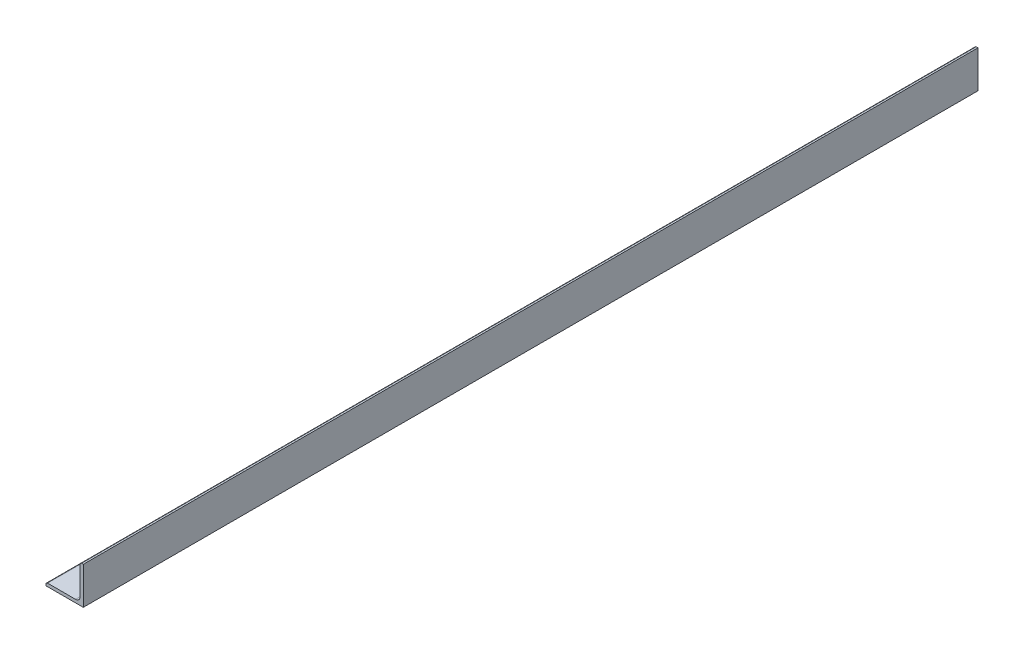
ISO-10303-21;
HEADER;
FILE_DESCRIPTION(('STEP AP214'),'2;1');
FILE_NAME('part.step','',(''),(''),'','','');
FILE_SCHEMA(('AUTOMOTIVE_DESIGN { 1 0 10303 214 1 1 1 1 }'));
ENDSEC;
DATA;
#1=APPLICATION_CONTEXT('core data for automotive mechanical design processes');
#2=APPLICATION_PROTOCOL_DEFINITION('international standard','automotive_design',2000,#1);
#3=PRODUCT_CONTEXT('',#1,'mechanical');
#4=PRODUCT('Part','Part','',(#3));
#5=PRODUCT_RELATED_PRODUCT_CATEGORY('part','',(#4));
#6=PRODUCT_DEFINITION_FORMATION('','',#4);
#7=PRODUCT_DEFINITION_CONTEXT('part definition',#1,'design');
#8=PRODUCT_DEFINITION('design','',#6,#7);
#9=PRODUCT_DEFINITION_SHAPE('','',#8);
#10=(LENGTH_UNIT() NAMED_UNIT(*) SI_UNIT(.MILLI.,.METRE.));
#11=(NAMED_UNIT(*) PLANE_ANGLE_UNIT() SI_UNIT($,.RADIAN.));
#12=(NAMED_UNIT(*) SI_UNIT($,.STERADIAN.) SOLID_ANGLE_UNIT());
#13=UNCERTAINTY_MEASURE_WITH_UNIT(LENGTH_MEASURE(1.E-05),#10,'distance_accuracy_value','');
#14=(GEOMETRIC_REPRESENTATION_CONTEXT(3) GLOBAL_UNCERTAINTY_ASSIGNED_CONTEXT((#13)) GLOBAL_UNIT_ASSIGNED_CONTEXT((#10,
#11,#12)) REPRESENTATION_CONTEXT('',''));
#15=CARTESIAN_POINT('',(0.,0.,0.));
#16=DIRECTION('',(0.,0.,1.));
#17=DIRECTION('',(1.,0.,0.));
#18=AXIS2_PLACEMENT_3D('',#15,#16,#17);
#19=CARTESIAN_POINT('',(-19.05,-17.4625,457.2));
#20=DIRECTION('',(1.,0.,0.));
#21=DIRECTION('',(0.,0.,-1.));
#22=AXIS2_PLACEMENT_3D('',#19,#20,#21);
#23=PLANE('',#22);
#24=DIRECTION('',(0.,-1.,0.));
#25=VECTOR('',#24,1.);
#26=CARTESIAN_POINT('',(-19.05,-17.4625,-457.2));
#27=LINE('',#26,#25);
#28=CARTESIAN_POINT('',(-19.05,-17.4625,-457.2));
#29=VERTEX_POINT('',#28);
#30=CARTESIAN_POINT('',(-19.05,-19.05,-457.2));
#31=VERTEX_POINT('',#30);
#32=EDGE_CURVE('E150',#29,#31,#27,.T.);
#33=ORIENTED_EDGE('',*,*,#32,.T.);
#34=DIRECTION('',(0.,0.,-1.));
#35=VECTOR('',#34,1.);
#36=CARTESIAN_POINT('',(-19.05,-19.05,457.2));
#37=LINE('',#36,#35);
#38=CARTESIAN_POINT('',(-19.05,-19.05,457.2));
#39=VERTEX_POINT('',#38);
#40=EDGE_CURVE('E11',#39,#31,#37,.T.);
#41=ORIENTED_EDGE('',*,*,#40,.F.);
#42=DIRECTION('',(0.,-1.,0.));
#43=VECTOR('',#42,1.);
#44=CARTESIAN_POINT('',(-19.05,-17.4625,457.2));
#45=LINE('',#44,#43);
#46=CARTESIAN_POINT('',(-19.05,-17.4625,457.2));
#47=VERTEX_POINT('',#46);
#48=EDGE_CURVE('E175',#47,#39,#45,.T.);
#49=ORIENTED_EDGE('',*,*,#48,.F.);
#50=DIRECTION('',(0.,0.,-1.));
#51=VECTOR('',#50,1.);
#52=CARTESIAN_POINT('',(-19.05,-17.4625,457.2));
#53=LINE('',#52,#51);
#54=EDGE_CURVE('E146',#47,#29,#53,.T.);
#55=ORIENTED_EDGE('',*,*,#54,.T.);
#56=EDGE_LOOP('',(#33,#41,#49,#55));
#57=FACE_BOUND('',#56,.T.);
#58=ADVANCED_FACE('F43',(#57),#23,.F.);
#59=CARTESIAN_POINT('',(-19.05,-19.05,457.2));
#60=DIRECTION('',(0.,1.,0.));
#61=DIRECTION('',(-1.,0.,0.));
#62=AXIS2_PLACEMENT_3D('',#59,#60,#61);
#63=PLANE('',#62);
#64=DIRECTION('',(1.,0.,0.));
#65=VECTOR('',#64,1.);
#66=CARTESIAN_POINT('',(-19.05,-19.05,-457.2));
#67=LINE('',#66,#65);
#68=CARTESIAN_POINT('',(19.05,-19.05,-457.2));
#69=VERTEX_POINT('',#68);
#70=EDGE_CURVE('E154',#31,#69,#67,.T.);
#71=ORIENTED_EDGE('',*,*,#70,.T.);
#72=DIRECTION('',(0.,0.,-1.));
#73=VECTOR('',#72,1.);
#74=CARTESIAN_POINT('',(19.05,-19.05,457.2));
#75=LINE('',#74,#73);
#76=CARTESIAN_POINT('',(19.05,-19.05,457.2));
#77=VERTEX_POINT('',#76);
#78=EDGE_CURVE('E52',#77,#69,#75,.T.);
#79=ORIENTED_EDGE('',*,*,#78,.F.);
#80=DIRECTION('',(1.,0.,0.));
#81=VECTOR('',#80,1.);
#82=CARTESIAN_POINT('',(-19.05,-19.05,457.2));
#83=LINE('',#82,#81);
#84=EDGE_CURVE('E106',#39,#77,#83,.T.);
#85=ORIENTED_EDGE('',*,*,#84,.F.);
#86=ORIENTED_EDGE('',*,*,#40,.T.);
#87=EDGE_LOOP('',(#71,#79,#85,#86));
#88=FACE_BOUND('',#87,.T.);
#89=ADVANCED_FACE('F231',(#88),#63,.F.);
#90=CARTESIAN_POINT('',(19.05,-19.05,457.2));
#91=DIRECTION('',(-1.,0.,0.));
#92=DIRECTION('',(0.,-1.,0.));
#93=AXIS2_PLACEMENT_3D('',#90,#91,#92);
#94=PLANE('',#93);
#95=DIRECTION('',(0.,1.,0.));
#96=VECTOR('',#95,1.);
#97=CARTESIAN_POINT('',(19.05,-19.05,-457.2));
#98=LINE('',#97,#96);
#99=CARTESIAN_POINT('',(19.05,19.05,-457.2));
#100=VERTEX_POINT('',#99);
#101=EDGE_CURVE('E157',#69,#100,#98,.T.);
#102=ORIENTED_EDGE('',*,*,#101,.T.);
#103=DIRECTION('',(0.,0.,-1.));
#104=VECTOR('',#103,1.);
#105=CARTESIAN_POINT('',(19.05,19.05,457.2));
#106=LINE('',#105,#104);
#107=CARTESIAN_POINT('',(19.05,19.05,457.2));
#108=VERTEX_POINT('',#107);
#109=EDGE_CURVE('E190',#108,#100,#106,.T.);
#110=ORIENTED_EDGE('',*,*,#109,.F.);
#111=DIRECTION('',(0.,1.,0.));
#112=VECTOR('',#111,1.);
#113=CARTESIAN_POINT('',(19.05,-19.05,457.2));
#114=LINE('',#113,#112);
#115=EDGE_CURVE('E200',#77,#108,#114,.T.);
#116=ORIENTED_EDGE('',*,*,#115,.F.);
#117=ORIENTED_EDGE('',*,*,#78,.T.);
#118=EDGE_LOOP('',(#102,#110,#116,#117));
#119=FACE_BOUND('',#118,.T.);
#120=ADVANCED_FACE('F198',(#119),#94,.F.);
#121=CARTESIAN_POINT('',(17.4625,19.05,457.2));
#122=DIRECTION('',(0.,-1.,0.));
#123=DIRECTION('',(1.,0.,0.));
#124=AXIS2_PLACEMENT_3D('',#121,#122,#123);
#125=PLANE('',#124);
#126=DIRECTION('',(-1.,0.,0.));
#127=VECTOR('',#126,1.);
#128=CARTESIAN_POINT('',(17.4625,19.05,-457.2));
#129=LINE('',#128,#127);
#130=CARTESIAN_POINT('',(17.4625,19.05,-457.2));
#131=VERTEX_POINT('',#130);
#132=EDGE_CURVE('E160',#100,#131,#129,.T.);
#133=ORIENTED_EDGE('',*,*,#132,.T.);
#134=DIRECTION('',(0.,0.,-1.));
#135=VECTOR('',#134,1.);
#136=CARTESIAN_POINT('',(17.4625,19.05,457.2));
#137=LINE('',#136,#135);
#138=CARTESIAN_POINT('',(17.4625,19.05,457.2));
#139=VERTEX_POINT('',#138);
#140=EDGE_CURVE('E186',#139,#131,#137,.T.);
#141=ORIENTED_EDGE('',*,*,#140,.F.);
#142=DIRECTION('',(-1.,0.,0.));
#143=VECTOR('',#142,1.);
#144=CARTESIAN_POINT('',(17.4625,19.05,457.2));
#145=LINE('',#144,#143);
#146=EDGE_CURVE('E217',#108,#139,#145,.T.);
#147=ORIENTED_EDGE('',*,*,#146,.F.);
#148=ORIENTED_EDGE('',*,*,#109,.T.);
#149=EDGE_LOOP('',(#133,#141,#147,#148));
#150=FACE_BOUND('',#149,.T.);
#151=ADVANCED_FACE('F209',(#150),#125,.F.);
#152=CARTESIAN_POINT('',(17.4625,17.4625,457.2));
#153=DIRECTION('',(0.,0.,-1.));
#154=DIRECTION('',(-1.,0.,0.));
#155=AXIS2_PLACEMENT_3D('',#152,#153,#154);
#156=CYLINDRICAL_SURFACE('',#155,1.5875);
#157=CARTESIAN_POINT('',(17.4625,17.4625,-457.2));
#158=DIRECTION('',(0.,0.,1.));
#159=DIRECTION('',(-1.,0.,0.));
#160=AXIS2_PLACEMENT_3D('',#157,#158,#159);
#161=CIRCLE('',#160,1.5875);
#162=CARTESIAN_POINT('',(15.875,17.4625,-457.2));
#163=VERTEX_POINT('',#162);
#164=EDGE_CURVE('E163',#131,#163,#161,.T.);
#165=ORIENTED_EDGE('',*,*,#164,.T.);
#166=DIRECTION('',(0.,0.,-1.));
#167=VECTOR('',#166,1.);
#168=CARTESIAN_POINT('',(15.875,17.4625,457.2));
#169=LINE('',#168,#167);
#170=CARTESIAN_POINT('',(15.875,17.4625,457.2));
#171=VERTEX_POINT('',#170);
#172=EDGE_CURVE('E182',#171,#163,#169,.T.);
#173=ORIENTED_EDGE('',*,*,#172,.F.);
#174=CARTESIAN_POINT('',(17.4625,17.4625,457.2));
#175=DIRECTION('',(0.,0.,1.));
#176=DIRECTION('',(-1.,0.,0.));
#177=AXIS2_PLACEMENT_3D('',#174,#175,#176);
#178=CIRCLE('',#177,1.5875);
#179=EDGE_CURVE('E215',#139,#171,#178,.T.);
#180=ORIENTED_EDGE('',*,*,#179,.F.);
#181=ORIENTED_EDGE('',*,*,#140,.T.);
#182=EDGE_LOOP('',(#165,#173,#180,#181));
#183=FACE_BOUND('',#182,.T.);
#184=ADVANCED_FACE('F213',(#183),#156,.T.);
#185=CARTESIAN_POINT('',(15.875,17.4625,457.2));
#186=DIRECTION('',(1.,0.,0.));
#187=DIRECTION('',(0.,1.,0.));
#188=AXIS2_PLACEMENT_3D('',#185,#186,#187);
#189=PLANE('',#188);
#190=DIRECTION('',(0.,-1.,0.));
#191=VECTOR('',#190,1.);
#192=CARTESIAN_POINT('',(15.875,17.4625,-457.2));
#193=LINE('',#192,#191);
#194=CARTESIAN_POINT('',(15.875,-11.0998,-457.2));
#195=VERTEX_POINT('',#194);
#196=EDGE_CURVE('E166',#163,#195,#193,.T.);
#197=ORIENTED_EDGE('',*,*,#196,.T.);
#198=DIRECTION('',(0.,0.,-1.));
#199=VECTOR('',#198,1.);
#200=CARTESIAN_POINT('',(15.875,-11.0998,457.2));
#201=LINE('',#200,#199);
#202=CARTESIAN_POINT('',(15.875,-11.0998,457.2));
#203=VERTEX_POINT('',#202);
#204=EDGE_CURVE('E139',#203,#195,#201,.T.);
#205=ORIENTED_EDGE('',*,*,#204,.F.);
#206=DIRECTION('',(0.,-1.,0.));
#207=VECTOR('',#206,1.);
#208=CARTESIAN_POINT('',(15.875,17.4625,457.2));
#209=LINE('',#208,#207);
#210=EDGE_CURVE('E128',#171,#203,#209,.T.);
#211=ORIENTED_EDGE('',*,*,#210,.F.);
#212=ORIENTED_EDGE('',*,*,#172,.T.);
#213=EDGE_LOOP('',(#197,#205,#211,#212));
#214=FACE_BOUND('',#213,.T.);
#215=ADVANCED_FACE('F243',(#214),#189,.F.);
#216=CARTESIAN_POINT('',(11.0998,-11.0998,457.2));
#217=DIRECTION('',(0.,0.,-1.));
#218=DIRECTION('',(-1.,0.,0.));
#219=AXIS2_PLACEMENT_3D('',#216,#217,#218);
#220=CYLINDRICAL_SURFACE('',#219,4.7752);
#221=CARTESIAN_POINT('',(11.0998,-11.0998,-457.2));
#222=DIRECTION('',(0.,0.,-1.));
#223=DIRECTION('',(-1.,0.,0.));
#224=AXIS2_PLACEMENT_3D('',#221,#222,#223);
#225=CIRCLE('',#224,4.7752);
#226=CARTESIAN_POINT('',(11.0998,-15.875,-457.2));
#227=VERTEX_POINT('',#226);
#228=EDGE_CURVE('E137',#195,#227,#225,.T.);
#229=ORIENTED_EDGE('',*,*,#228,.T.);
#230=DIRECTION('',(0.,0.,-1.));
#231=VECTOR('',#230,1.);
#232=CARTESIAN_POINT('',(11.0998,-15.875,457.2));
#233=LINE('',#232,#231);
#234=CARTESIAN_POINT('',(11.0998,-15.875,457.2));
#235=VERTEX_POINT('',#234);
#236=EDGE_CURVE('E134',#235,#227,#233,.T.);
#237=ORIENTED_EDGE('',*,*,#236,.F.);
#238=CARTESIAN_POINT('',(11.0998,-11.0998,457.2));
#239=DIRECTION('',(0.,0.,-1.));
#240=DIRECTION('',(-1.,0.,0.));
#241=AXIS2_PLACEMENT_3D('',#238,#239,#240);
#242=CIRCLE('',#241,4.7752);
#243=EDGE_CURVE('E122',#203,#235,#242,.T.);
#244=ORIENTED_EDGE('',*,*,#243,.F.);
#245=ORIENTED_EDGE('',*,*,#204,.T.);
#246=EDGE_LOOP('',(#229,#237,#244,#245));
#247=FACE_BOUND('',#246,.T.);
#248=ADVANCED_FACE('F135',(#247),#220,.F.);
#249=CARTESIAN_POINT('',(11.0998,-15.875,457.2));
#250=DIRECTION('',(0.,-1.,0.));
#251=DIRECTION('',(1.,0.,0.));
#252=AXIS2_PLACEMENT_3D('',#249,#250,#251);
#253=PLANE('',#252);
#254=DIRECTION('',(-1.,0.,0.));
#255=VECTOR('',#254,1.);
#256=CARTESIAN_POINT('',(11.0998,-15.875,-457.2));
#257=LINE('',#256,#255);
#258=CARTESIAN_POINT('',(-17.4625,-15.875,-457.2));
#259=VERTEX_POINT('',#258);
#260=EDGE_CURVE('E92',#227,#259,#257,.T.);
#261=ORIENTED_EDGE('',*,*,#260,.T.);
#262=DIRECTION('',(0.,0.,-1.));
#263=VECTOR('',#262,1.);
#264=CARTESIAN_POINT('',(-17.4625,-15.875,457.2));
#265=LINE('',#264,#263);
#266=CARTESIAN_POINT('',(-17.4625,-15.875,457.2));
#267=VERTEX_POINT('',#266);
#268=EDGE_CURVE('E140',#267,#259,#265,.T.);
#269=ORIENTED_EDGE('',*,*,#268,.F.);
#270=DIRECTION('',(-1.,0.,0.));
#271=VECTOR('',#270,1.);
#272=CARTESIAN_POINT('',(11.0998,-15.875,457.2));
#273=LINE('',#272,#271);
#274=EDGE_CURVE('E126',#235,#267,#273,.T.);
#275=ORIENTED_EDGE('',*,*,#274,.F.);
#276=ORIENTED_EDGE('',*,*,#236,.T.);
#277=EDGE_LOOP('',(#261,#269,#275,#276));
#278=FACE_BOUND('',#277,.T.);
#279=ADVANCED_FACE('F142',(#278),#253,.F.);
#280=CARTESIAN_POINT('',(-17.4625,-17.4625,457.2));
#281=DIRECTION('',(0.,0.,-1.));
#282=DIRECTION('',(-1.,0.,0.));
#283=AXIS2_PLACEMENT_3D('',#280,#281,#282);
#284=CYLINDRICAL_SURFACE('',#283,1.5875);
#285=CARTESIAN_POINT('',(-17.4625,-17.4625,-457.2));
#286=DIRECTION('',(0.,0.,1.));
#287=DIRECTION('',(-1.,0.,0.));
#288=AXIS2_PLACEMENT_3D('',#285,#286,#287);
#289=CIRCLE('',#288,1.5875);
#290=EDGE_CURVE('E98',#259,#29,#289,.T.);
#291=ORIENTED_EDGE('',*,*,#290,.T.);
#292=ORIENTED_EDGE('',*,*,#54,.F.);
#293=CARTESIAN_POINT('',(-17.4625,-17.4625,457.2));
#294=DIRECTION('',(0.,0.,1.));
#295=DIRECTION('',(-1.,0.,0.));
#296=AXIS2_PLACEMENT_3D('',#293,#294,#295);
#297=CIRCLE('',#296,1.5875);
#298=EDGE_CURVE('E60',#267,#47,#297,.T.);
#299=ORIENTED_EDGE('',*,*,#298,.F.);
#300=ORIENTED_EDGE('',*,*,#268,.T.);
#301=EDGE_LOOP('',(#291,#292,#299,#300));
#302=FACE_BOUND('',#301,.T.);
#303=ADVANCED_FACE('F251',(#302),#284,.T.);
#304=CARTESIAN_POINT('',(17.4625,17.4625,457.2));
#305=DIRECTION('',(0.,0.,-1.));
#306=DIRECTION('',(-1.,0.,0.));
#307=AXIS2_PLACEMENT_3D('',#304,#305,#306);
#308=PLANE('',#307);
#309=ORIENTED_EDGE('',*,*,#48,.T.);
#310=ORIENTED_EDGE('',*,*,#84,.T.);
#311=ORIENTED_EDGE('',*,*,#115,.T.);
#312=ORIENTED_EDGE('',*,*,#146,.T.);
#313=ORIENTED_EDGE('',*,*,#179,.T.);
#314=ORIENTED_EDGE('',*,*,#210,.T.);
#315=ORIENTED_EDGE('',*,*,#243,.T.);
#316=ORIENTED_EDGE('',*,*,#274,.T.);
#317=ORIENTED_EDGE('',*,*,#298,.T.);
#318=EDGE_LOOP('',(#309,#310,#311,#312,#313,#314,#315,#316,#317));
#319=FACE_BOUND('',#318,.T.);
#320=ADVANCED_FACE('F124',(#319),#308,.F.);
#321=CARTESIAN_POINT('',(17.4625,17.4625,-457.2));
#322=DIRECTION('',(0.,0.,-1.));
#323=DIRECTION('',(-1.,0.,0.));
#324=AXIS2_PLACEMENT_3D('',#321,#322,#323);
#325=PLANE('',#324);
#326=ORIENTED_EDGE('',*,*,#32,.F.);
#327=ORIENTED_EDGE('',*,*,#290,.F.);
#328=ORIENTED_EDGE('',*,*,#260,.F.);
#329=ORIENTED_EDGE('',*,*,#228,.F.);
#330=ORIENTED_EDGE('',*,*,#196,.F.);
#331=ORIENTED_EDGE('',*,*,#164,.F.);
#332=ORIENTED_EDGE('',*,*,#132,.F.);
#333=ORIENTED_EDGE('',*,*,#101,.F.);
#334=ORIENTED_EDGE('',*,*,#70,.F.);
#335=EDGE_LOOP('',(#326,#327,#328,#329,#330,#331,#332,#333,#334));
#336=FACE_BOUND('',#335,.T.);
#337=ADVANCED_FACE('F204',(#336),#325,.T.);
#338=CLOSED_SHELL('',(#58,#89,#120,#151,#184,#215,#248,#279,#303,#320,#337));
#339=MANIFOLD_SOLID_BREP('B2',#338);
#340=ADVANCED_BREP_SHAPE_REPRESENTATION('',(#18,#339),#14);
#341=SHAPE_DEFINITION_REPRESENTATION(#9,#340);
ENDSEC;
END-ISO-10303-21;
